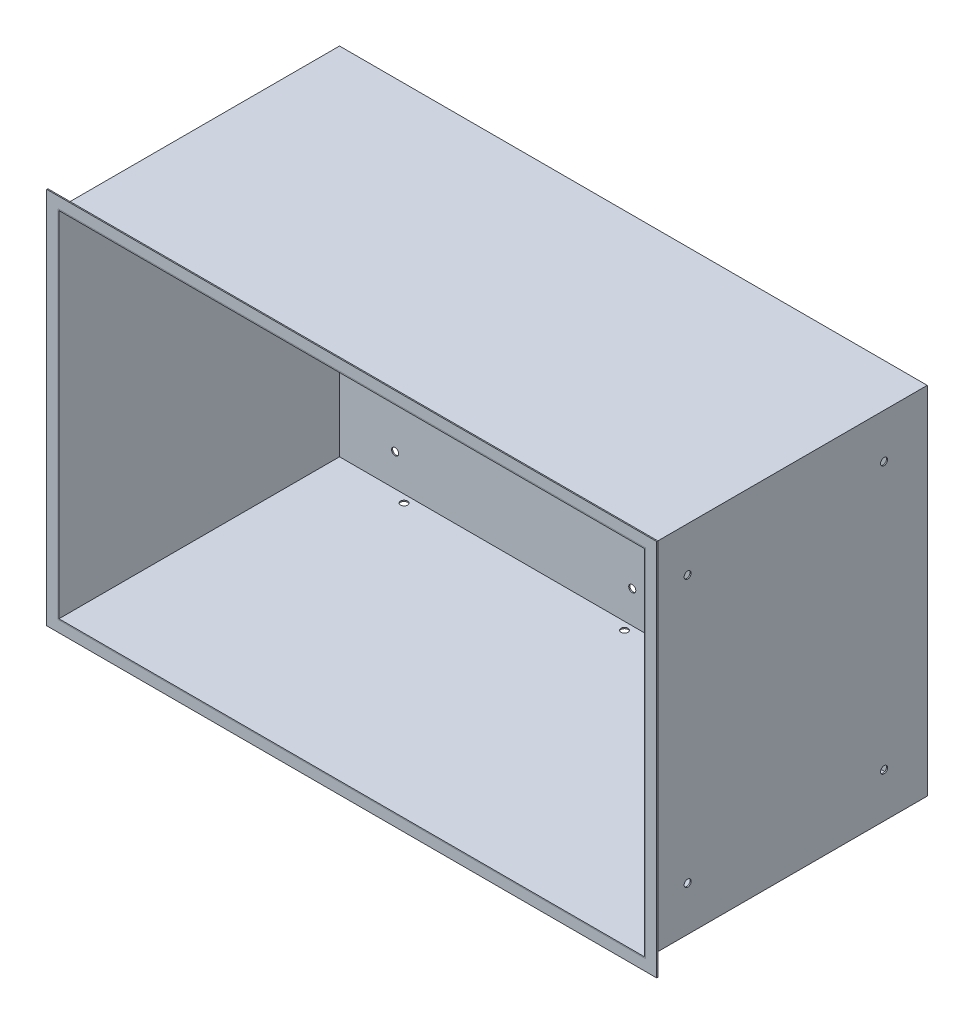
ISO-10303-21;
HEADER;
FILE_DESCRIPTION(('STEP AP214'),'2;1');
FILE_NAME('part.step','',(''),(''),'','','');
FILE_SCHEMA(('AUTOMOTIVE_DESIGN { 1 0 10303 214 1 1 1 1 }'));
ENDSEC;
DATA;
#1=APPLICATION_CONTEXT('core data for automotive mechanical design processes');
#2=APPLICATION_PROTOCOL_DEFINITION('international standard','automotive_design',2000,#1);
#3=PRODUCT_CONTEXT('',#1,'mechanical');
#4=PRODUCT('Part','Part','',(#3));
#5=PRODUCT_RELATED_PRODUCT_CATEGORY('part','',(#4));
#6=PRODUCT_DEFINITION_FORMATION('','',#4);
#7=PRODUCT_DEFINITION_CONTEXT('part definition',#1,'design');
#8=PRODUCT_DEFINITION('design','',#6,#7);
#9=PRODUCT_DEFINITION_SHAPE('','',#8);
#10=(LENGTH_UNIT() NAMED_UNIT(*) SI_UNIT(.MILLI.,.METRE.));
#11=(NAMED_UNIT(*) PLANE_ANGLE_UNIT() SI_UNIT($,.RADIAN.));
#12=(NAMED_UNIT(*) SI_UNIT($,.STERADIAN.) SOLID_ANGLE_UNIT());
#13=UNCERTAINTY_MEASURE_WITH_UNIT(LENGTH_MEASURE(1.E-05),#10,'distance_accuracy_value','');
#14=(GEOMETRIC_REPRESENTATION_CONTEXT(3) GLOBAL_UNCERTAINTY_ASSIGNED_CONTEXT((#13)) GLOBAL_UNIT_ASSIGNED_CONTEXT((#10,
#11,#12)) REPRESENTATION_CONTEXT('',''));
#15=CARTESIAN_POINT('',(0.,0.,0.));
#16=DIRECTION('',(0.,0.,1.));
#17=DIRECTION('',(1.,0.,0.));
#18=AXIS2_PLACEMENT_3D('',#15,#16,#17);
#19=CARTESIAN_POINT('',(411.5,495.,188.48));
#20=DIRECTION('',(0.,1.,0.));
#21=DIRECTION('',(-1.,0.,0.));
#22=AXIS2_PLACEMENT_3D('',#19,#20,#21);
#23=PLANE('',#22);
#24=DIRECTION('',(-1.,0.,0.));
#25=VECTOR('',#24,1.);
#26=CARTESIAN_POINT('',(411.5,495.,190.));
#27=LINE('',#26,#25);
#28=CARTESIAN_POINT('',(411.5,495.,190.));
#29=VERTEX_POINT('',#28);
#30=CARTESIAN_POINT('',(-411.5,495.,190.));
#31=VERTEX_POINT('',#30);
#32=EDGE_CURVE('E140',#29,#31,#27,.T.);
#33=ORIENTED_EDGE('',*,*,#32,.F.);
#34=DIRECTION('',(0.,0.,1.));
#35=VECTOR('',#34,1.);
#36=CARTESIAN_POINT('',(411.5,495.,188.48));
#37=LINE('',#36,#35);
#38=CARTESIAN_POINT('',(411.5,495.,188.48));
#39=VERTEX_POINT('',#38);
#40=EDGE_CURVE('E12',#39,#29,#37,.T.);
#41=ORIENTED_EDGE('',*,*,#40,.F.);
#42=DIRECTION('',(-1.,0.,0.));
#43=VECTOR('',#42,1.);
#44=CARTESIAN_POINT('',(411.5,495.,188.48));
#45=LINE('',#44,#43);
#46=CARTESIAN_POINT('',(-411.5,495.,188.48));
#47=VERTEX_POINT('',#46);
#48=EDGE_CURVE('E144',#39,#47,#45,.T.);
#49=ORIENTED_EDGE('',*,*,#48,.T.);
#50=DIRECTION('',(0.,0.,1.));
#51=VECTOR('',#50,1.);
#52=CARTESIAN_POINT('',(-411.5,495.,188.48));
#53=LINE('',#52,#51);
#54=EDGE_CURVE('E45',#47,#31,#53,.T.);
#55=ORIENTED_EDGE('',*,*,#54,.T.);
#56=EDGE_LOOP('',(#33,#41,#49,#55));
#57=FACE_BOUND('',#56,.T.);
#58=ADVANCED_FACE('F42',(#57),#23,.T.);
#59=CARTESIAN_POINT('',(411.5,-15.,188.48));
#60=DIRECTION('',(1.,0.,0.));
#61=DIRECTION('',(0.,0.,-1.));
#62=AXIS2_PLACEMENT_3D('',#59,#60,#61);
#63=PLANE('',#62);
#64=DIRECTION('',(0.,1.,0.));
#65=VECTOR('',#64,1.);
#66=CARTESIAN_POINT('',(411.5,-15.,190.));
#67=LINE('',#66,#65);
#68=CARTESIAN_POINT('',(411.5,-15.,190.));
#69=VERTEX_POINT('',#68);
#70=EDGE_CURVE('E148',#69,#29,#67,.T.);
#71=ORIENTED_EDGE('',*,*,#70,.F.);
#72=DIRECTION('',(0.,0.,1.));
#73=VECTOR('',#72,1.);
#74=CARTESIAN_POINT('',(411.5,-15.,188.48));
#75=LINE('',#74,#73);
#76=CARTESIAN_POINT('',(411.5,-15.,188.48));
#77=VERTEX_POINT('',#76);
#78=EDGE_CURVE('E50',#77,#69,#75,.T.);
#79=ORIENTED_EDGE('',*,*,#78,.F.);
#80=DIRECTION('',(0.,1.,0.));
#81=VECTOR('',#80,1.);
#82=CARTESIAN_POINT('',(411.5,-15.,188.48));
#83=LINE('',#82,#81);
#84=EDGE_CURVE('E154',#77,#39,#83,.T.);
#85=ORIENTED_EDGE('',*,*,#84,.T.);
#86=ORIENTED_EDGE('',*,*,#40,.T.);
#87=EDGE_LOOP('',(#71,#79,#85,#86));
#88=FACE_BOUND('',#87,.T.);
#89=ADVANCED_FACE('F180',(#88),#63,.T.);
#90=CARTESIAN_POINT('',(-411.5,-15.,188.48));
#91=DIRECTION('',(0.,-1.,0.));
#92=DIRECTION('',(0.,0.,-1.));
#93=AXIS2_PLACEMENT_3D('',#90,#91,#92);
#94=PLANE('',#93);
#95=DIRECTION('',(1.,0.,0.));
#96=VECTOR('',#95,1.);
#97=CARTESIAN_POINT('',(-411.5,-15.,190.));
#98=LINE('',#97,#96);
#99=CARTESIAN_POINT('',(-411.5,-15.,190.));
#100=VERTEX_POINT('',#99);
#101=EDGE_CURVE('E162',#100,#69,#98,.T.);
#102=ORIENTED_EDGE('',*,*,#101,.F.);
#103=DIRECTION('',(0.,0.,1.));
#104=VECTOR('',#103,1.);
#105=CARTESIAN_POINT('',(-411.5,-15.,188.48));
#106=LINE('',#105,#104);
#107=CARTESIAN_POINT('',(-411.5,-15.,188.48));
#108=VERTEX_POINT('',#107);
#109=EDGE_CURVE('E167',#108,#100,#106,.T.);
#110=ORIENTED_EDGE('',*,*,#109,.F.);
#111=DIRECTION('',(1.,0.,0.));
#112=VECTOR('',#111,1.);
#113=CARTESIAN_POINT('',(-411.5,-15.,188.48));
#114=LINE('',#113,#112);
#115=EDGE_CURVE('E151',#108,#77,#114,.T.);
#116=ORIENTED_EDGE('',*,*,#115,.T.);
#117=ORIENTED_EDGE('',*,*,#78,.T.);
#118=EDGE_LOOP('',(#102,#110,#116,#117));
#119=FACE_BOUND('',#118,.T.);
#120=ADVANCED_FACE('F184',(#119),#94,.T.);
#121=CARTESIAN_POINT('',(-411.5,495.,188.48));
#122=DIRECTION('',(-1.,0.,0.));
#123=DIRECTION('',(0.,-1.,0.));
#124=AXIS2_PLACEMENT_3D('',#121,#122,#123);
#125=PLANE('',#124);
#126=DIRECTION('',(0.,-1.,0.));
#127=VECTOR('',#126,1.);
#128=CARTESIAN_POINT('',(-411.5,495.,190.));
#129=LINE('',#128,#127);
#130=EDGE_CURVE('E159',#31,#100,#129,.T.);
#131=ORIENTED_EDGE('',*,*,#130,.F.);
#132=ORIENTED_EDGE('',*,*,#54,.F.);
#133=DIRECTION('',(0.,-1.,0.));
#134=VECTOR('',#133,1.);
#135=CARTESIAN_POINT('',(-411.5,495.,188.48));
#136=LINE('',#135,#134);
#137=EDGE_CURVE('E147',#47,#108,#136,.T.);
#138=ORIENTED_EDGE('',*,*,#137,.T.);
#139=ORIENTED_EDGE('',*,*,#109,.T.);
#140=EDGE_LOOP('',(#131,#132,#138,#139));
#141=FACE_BOUND('',#140,.T.);
#142=ADVANCED_FACE('F175',(#141),#125,.T.);
#143=CARTESIAN_POINT('',(0.,0.,188.48));
#144=DIRECTION('',(0.,0.,1.));
#145=DIRECTION('',(1.,0.,0.));
#146=AXIS2_PLACEMENT_3D('',#143,#144,#145);
#147=PLANE('',#146);
#148=DIRECTION('',(0.,1.,0.));
#149=VECTOR('',#148,1.);
#150=CARTESIAN_POINT('',(396.5,0.,188.48));
#151=LINE('',#150,#149);
#152=CARTESIAN_POINT('',(396.5,0.,188.48));
#153=VERTEX_POINT('',#152);
#154=CARTESIAN_POINT('',(396.5,480.,188.48));
#155=VERTEX_POINT('',#154);
#156=EDGE_CURVE('E115',#153,#155,#151,.T.);
#157=ORIENTED_EDGE('',*,*,#156,.T.);
#158=DIRECTION('',(-1.,0.,0.));
#159=VECTOR('',#158,1.);
#160=CARTESIAN_POINT('',(396.5,480.,188.48));
#161=LINE('',#160,#159);
#162=CARTESIAN_POINT('',(-396.5,480.,188.48));
#163=VERTEX_POINT('',#162);
#164=EDGE_CURVE('E109',#155,#163,#161,.T.);
#165=ORIENTED_EDGE('',*,*,#164,.T.);
#166=DIRECTION('',(0.,-1.,0.));
#167=VECTOR('',#166,1.);
#168=CARTESIAN_POINT('',(-396.5,480.,188.48));
#169=LINE('',#168,#167);
#170=CARTESIAN_POINT('',(-396.5,0.,188.48));
#171=VERTEX_POINT('',#170);
#172=EDGE_CURVE('E118',#163,#171,#169,.T.);
#173=ORIENTED_EDGE('',*,*,#172,.T.);
#174=DIRECTION('',(1.,0.,0.));
#175=VECTOR('',#174,1.);
#176=CARTESIAN_POINT('',(-396.5,0.,188.48));
#177=LINE('',#176,#175);
#178=EDGE_CURVE('E58',#171,#153,#177,.T.);
#179=ORIENTED_EDGE('',*,*,#178,.T.);
#180=EDGE_LOOP('',(#157,#165,#173,#179));
#181=FACE_BOUND('',#180,.T.);
#182=ORIENTED_EDGE('',*,*,#48,.F.);
#183=ORIENTED_EDGE('',*,*,#84,.F.);
#184=ORIENTED_EDGE('',*,*,#115,.F.);
#185=ORIENTED_EDGE('',*,*,#137,.F.);
#186=EDGE_LOOP('',(#182,#183,#184,#185));
#187=FACE_BOUND('',#186,.T.);
#188=ADVANCED_FACE('F122',(#181,#187),#147,.F.);
#189=CARTESIAN_POINT('',(0.,0.,190.));
#190=DIRECTION('',(0.,0.,1.));
#191=DIRECTION('',(1.,0.,0.));
#192=AXIS2_PLACEMENT_3D('',#189,#190,#191);
#193=PLANE('',#192);
#194=DIRECTION('',(-1.,0.,0.));
#195=VECTOR('',#194,1.);
#196=CARTESIAN_POINT('',(396.5,480.,190.));
#197=LINE('',#196,#195);
#198=CARTESIAN_POINT('',(396.5,480.,190.));
#199=VERTEX_POINT('',#198);
#200=CARTESIAN_POINT('',(-396.5,480.,190.));
#201=VERTEX_POINT('',#200);
#202=EDGE_CURVE('E66',#199,#201,#197,.T.);
#203=ORIENTED_EDGE('',*,*,#202,.F.);
#204=DIRECTION('',(0.,1.,0.));
#205=VECTOR('',#204,1.);
#206=CARTESIAN_POINT('',(396.5,0.,190.));
#207=LINE('',#206,#205);
#208=CARTESIAN_POINT('',(396.5,0.,190.));
#209=VERTEX_POINT('',#208);
#210=EDGE_CURVE('E125',#209,#199,#207,.T.);
#211=ORIENTED_EDGE('',*,*,#210,.F.);
#212=DIRECTION('',(1.,0.,0.));
#213=VECTOR('',#212,1.);
#214=CARTESIAN_POINT('',(-396.5,0.,190.));
#215=LINE('',#214,#213);
#216=CARTESIAN_POINT('',(-396.5,0.,190.));
#217=VERTEX_POINT('',#216);
#218=EDGE_CURVE('E128',#217,#209,#215,.T.);
#219=ORIENTED_EDGE('',*,*,#218,.F.);
#220=DIRECTION('',(0.,-1.,0.));
#221=VECTOR('',#220,1.);
#222=CARTESIAN_POINT('',(-396.5,480.,190.));
#223=LINE('',#222,#221);
#224=EDGE_CURVE('E134',#201,#217,#223,.T.);
#225=ORIENTED_EDGE('',*,*,#224,.F.);
#226=EDGE_LOOP('',(#203,#211,#219,#225));
#227=FACE_BOUND('',#226,.T.);
#228=ORIENTED_EDGE('',*,*,#32,.T.);
#229=ORIENTED_EDGE('',*,*,#130,.T.);
#230=ORIENTED_EDGE('',*,*,#101,.T.);
#231=ORIENTED_EDGE('',*,*,#70,.T.);
#232=EDGE_LOOP('',(#228,#229,#230,#231));
#233=FACE_BOUND('',#232,.T.);
#234=ADVANCED_FACE('F177',(#227,#233),#193,.T.);
#235=CARTESIAN_POINT('',(396.5,480.,188.48));
#236=DIRECTION('',(0.,1.,0.));
#237=DIRECTION('',(0.,0.,1.));
#238=AXIS2_PLACEMENT_3D('',#235,#236,#237);
#239=PLANE('',#238);
#240=ORIENTED_EDGE('',*,*,#202,.T.);
#241=DIRECTION('',(0.,0.,1.));
#242=VECTOR('',#241,1.);
#243=CARTESIAN_POINT('',(-396.5,480.,188.48));
#244=LINE('',#243,#242);
#245=EDGE_CURVE('E105',#163,#201,#244,.T.);
#246=ORIENTED_EDGE('',*,*,#245,.F.);
#247=ORIENTED_EDGE('',*,*,#164,.F.);
#248=DIRECTION('',(0.,0.,1.));
#249=VECTOR('',#248,1.);
#250=CARTESIAN_POINT('',(396.5,480.,188.48));
#251=LINE('',#250,#249);
#252=EDGE_CURVE('E138',#155,#199,#251,.T.);
#253=ORIENTED_EDGE('',*,*,#252,.T.);
#254=EDGE_LOOP('',(#240,#246,#247,#253));
#255=FACE_BOUND('',#254,.T.);
#256=ADVANCED_FACE('F107',(#255),#239,.F.);
#257=CARTESIAN_POINT('',(396.5,0.,188.48));
#258=DIRECTION('',(1.,0.,0.));
#259=DIRECTION('',(0.,0.,-1.));
#260=AXIS2_PLACEMENT_3D('',#257,#258,#259);
#261=PLANE('',#260);
#262=ORIENTED_EDGE('',*,*,#210,.T.);
#263=ORIENTED_EDGE('',*,*,#252,.F.);
#264=ORIENTED_EDGE('',*,*,#156,.F.);
#265=DIRECTION('',(0.,0.,1.));
#266=VECTOR('',#265,1.);
#267=CARTESIAN_POINT('',(396.5,0.,188.48));
#268=LINE('',#267,#266);
#269=EDGE_CURVE('E141',#153,#209,#268,.T.);
#270=ORIENTED_EDGE('',*,*,#269,.T.);
#271=EDGE_LOOP('',(#262,#263,#264,#270));
#272=FACE_BOUND('',#271,.T.);
#273=ADVANCED_FACE('F235',(#272),#261,.F.);
#274=CARTESIAN_POINT('',(-396.5,0.,188.48));
#275=DIRECTION('',(0.,-1.,0.));
#276=DIRECTION('',(0.,0.,-1.));
#277=AXIS2_PLACEMENT_3D('',#274,#275,#276);
#278=PLANE('',#277);
#279=ORIENTED_EDGE('',*,*,#218,.T.);
#280=ORIENTED_EDGE('',*,*,#269,.F.);
#281=ORIENTED_EDGE('',*,*,#178,.F.);
#282=DIRECTION('',(0.,0.,1.));
#283=VECTOR('',#282,1.);
#284=CARTESIAN_POINT('',(-396.5,0.,188.48));
#285=LINE('',#284,#283);
#286=EDGE_CURVE('E114',#171,#217,#285,.T.);
#287=ORIENTED_EDGE('',*,*,#286,.T.);
#288=EDGE_LOOP('',(#279,#280,#281,#287));
#289=FACE_BOUND('',#288,.T.);
#290=ADVANCED_FACE('F244',(#289),#278,.F.);
#291=CARTESIAN_POINT('',(-396.5,480.,188.48));
#292=DIRECTION('',(-1.,0.,0.));
#293=DIRECTION('',(0.,0.,1.));
#294=AXIS2_PLACEMENT_3D('',#291,#292,#293);
#295=PLANE('',#294);
#296=ORIENTED_EDGE('',*,*,#224,.T.);
#297=ORIENTED_EDGE('',*,*,#286,.F.);
#298=ORIENTED_EDGE('',*,*,#172,.F.);
#299=ORIENTED_EDGE('',*,*,#245,.T.);
#300=EDGE_LOOP('',(#296,#297,#298,#299));
#301=FACE_BOUND('',#300,.T.);
#302=ADVANCED_FACE('F119',(#301),#295,.F.);
#303=CLOSED_SHELL('',(#58,#89,#120,#142,#188,#234,#256,#273,#290,#302));
#304=MANIFOLD_SOLID_BREP('B2',#303);
#305=CARTESIAN_POINT('',(-396.5,480.,190.));
#306=DIRECTION('',(0.,0.,-1.));
#307=DIRECTION('',(-1.,0.,0.));
#308=AXIS2_PLACEMENT_3D('',#305,#306,#307);
#309=PLANE('',#308);
#310=DIRECTION('',(1.,0.,0.));
#311=VECTOR('',#310,1.);
#312=CARTESIAN_POINT('',(-396.5,0.,190.));
#313=LINE('',#312,#311);
#314=CARTESIAN_POINT('',(-396.5,0.,190.));
#315=VERTEX_POINT('',#314);
#316=CARTESIAN_POINT('',(396.5,0.,190.));
#317=VERTEX_POINT('',#316);
#318=EDGE_CURVE('E318',#315,#317,#313,.T.);
#319=ORIENTED_EDGE('',*,*,#318,.T.);
#320=DIRECTION('',(0.,-1.,0.));
#321=VECTOR('',#320,1.);
#322=CARTESIAN_POINT('',(396.5,480.,190.));
#323=LINE('',#322,#321);
#324=CARTESIAN_POINT('',(396.5,480.,190.));
#325=VERTEX_POINT('',#324);
#326=EDGE_CURVE('E390',#325,#317,#323,.T.);
#327=ORIENTED_EDGE('',*,*,#326,.F.);
#328=DIRECTION('',(1.,0.,0.));
#329=VECTOR('',#328,1.);
#330=CARTESIAN_POINT('',(-396.5,480.,190.));
#331=LINE('',#330,#329);
#332=CARTESIAN_POINT('',(-396.5,480.,190.));
#333=VERTEX_POINT('',#332);
#334=EDGE_CURVE('E297',#333,#325,#331,.T.);
#335=ORIENTED_EDGE('',*,*,#334,.F.);
#336=DIRECTION('',(0.,-1.,0.));
#337=VECTOR('',#336,1.);
#338=CARTESIAN_POINT('',(-396.5,480.,190.));
#339=LINE('',#338,#337);
#340=EDGE_CURVE('E400',#333,#315,#339,.T.);
#341=ORIENTED_EDGE('',*,*,#340,.T.);
#342=EDGE_LOOP('',(#319,#327,#335,#341));
#343=FACE_BOUND('',#342,.T.);
#344=DIRECTION('',(1.,0.,0.));
#345=VECTOR('',#344,1.);
#346=CARTESIAN_POINT('',(-396.5,1.52000000000002,190.));
#347=LINE('',#346,#345);
#348=CARTESIAN_POINT('',(-394.98,1.52,190.));
#349=VERTEX_POINT('',#348);
#350=CARTESIAN_POINT('',(394.98,1.52,190.));
#351=VERTEX_POINT('',#350);
#352=EDGE_CURVE('E371',#349,#351,#347,.T.);
#353=ORIENTED_EDGE('',*,*,#352,.F.);
#354=DIRECTION('',(0.,-1.,0.));
#355=VECTOR('',#354,1.);
#356=CARTESIAN_POINT('',(-394.98,480.,190.));
#357=LINE('',#356,#355);
#358=CARTESIAN_POINT('',(-394.98,478.48,190.));
#359=VERTEX_POINT('',#358);
#360=EDGE_CURVE('E366',#359,#349,#357,.T.);
#361=ORIENTED_EDGE('',*,*,#360,.F.);
#362=DIRECTION('',(1.,0.,0.));
#363=VECTOR('',#362,1.);
#364=CARTESIAN_POINT('',(-396.5,478.48,190.));
#365=LINE('',#364,#363);
#366=CARTESIAN_POINT('',(394.98,478.48,190.));
#367=VERTEX_POINT('',#366);
#368=EDGE_CURVE('E288',#359,#367,#365,.T.);
#369=ORIENTED_EDGE('',*,*,#368,.T.);
#370=DIRECTION('',(0.,-1.,0.));
#371=VECTOR('',#370,1.);
#372=CARTESIAN_POINT('',(394.98,480.,190.));
#373=LINE('',#372,#371);
#374=EDGE_CURVE('E379',#367,#351,#373,.T.);
#375=ORIENTED_EDGE('',*,*,#374,.T.);
#376=EDGE_LOOP('',(#353,#361,#369,#375));
#377=FACE_BOUND('',#376,.T.);
#378=ADVANCED_FACE('F271',(#343,#377),#309,.F.);
#379=CARTESIAN_POINT('',(396.5,480.,-190.));
#380=DIRECTION('',(-1.,0.,0.));
#381=DIRECTION('',(0.,0.,1.));
#382=AXIS2_PLACEMENT_3D('',#379,#380,#381);
#383=PLANE('',#382);
#384=CARTESIAN_POINT('',(396.5,60.0000000000001,133.26));
#385=DIRECTION('',(1.,0.,0.));
#386=DIRECTION('',(0.,0.,-1.));
#387=AXIS2_PLACEMENT_3D('',#384,#385,#386);
#388=CIRCLE('',#387,4.76250000000001);
#389=CARTESIAN_POINT('',(396.5,60.0000000000001,128.4975));
#390=VERTEX_POINT('',#389);
#391=EDGE_CURVE('E412',#390,#390,#388,.T.);
#392=ORIENTED_EDGE('',*,*,#391,.F.);
#393=EDGE_LOOP('',(#392));
#394=FACE_BOUND('',#393,.T.);
#395=CARTESIAN_POINT('',(396.5,420.,-131.74));
#396=DIRECTION('',(1.,0.,0.));
#397=DIRECTION('',(0.,0.,1.));
#398=AXIS2_PLACEMENT_3D('',#395,#396,#397);
#399=CIRCLE('',#398,4.76499999999997);
#400=CARTESIAN_POINT('',(396.5,420.,-126.975));
#401=VERTEX_POINT('',#400);
#402=EDGE_CURVE('E506',#401,#401,#399,.T.);
#403=ORIENTED_EDGE('',*,*,#402,.F.);
#404=EDGE_LOOP('',(#403));
#405=FACE_BOUND('',#404,.T.);
#406=CARTESIAN_POINT('',(396.5,420.,133.26));
#407=DIRECTION('',(1.,0.,0.));
#408=DIRECTION('',(0.,0.,1.));
#409=AXIS2_PLACEMENT_3D('',#406,#407,#408);
#410=CIRCLE('',#409,4.76250000000001);
#411=CARTESIAN_POINT('',(396.5,420.,138.0225));
#412=VERTEX_POINT('',#411);
#413=EDGE_CURVE('E503',#412,#412,#410,.T.);
#414=ORIENTED_EDGE('',*,*,#413,.F.);
#415=EDGE_LOOP('',(#414));
#416=FACE_BOUND('',#415,.T.);
#417=CARTESIAN_POINT('',(396.5,60.0000000000001,-131.74));
#418=DIRECTION('',(1.,0.,0.));
#419=DIRECTION('',(0.,0.,-1.));
#420=AXIS2_PLACEMENT_3D('',#417,#418,#419);
#421=CIRCLE('',#420,4.76499999999998);
#422=CARTESIAN_POINT('',(396.5,60.0000000000001,-136.505));
#423=VERTEX_POINT('',#422);
#424=EDGE_CURVE('E407',#423,#423,#421,.T.);
#425=ORIENTED_EDGE('',*,*,#424,.F.);
#426=EDGE_LOOP('',(#425));
#427=FACE_BOUND('',#426,.T.);
#428=DIRECTION('',(0.,0.,-1.));
#429=VECTOR('',#428,1.);
#430=CARTESIAN_POINT('',(396.5,0.,-190.));
#431=LINE('',#430,#429);
#432=CARTESIAN_POINT('',(396.5,0.,-190.));
#433=VERTEX_POINT('',#432);
#434=EDGE_CURVE('E391',#317,#433,#431,.T.);
#435=ORIENTED_EDGE('',*,*,#434,.T.);
#436=DIRECTION('',(0.,-1.,0.));
#437=VECTOR('',#436,1.);
#438=CARTESIAN_POINT('',(396.5,480.,-190.));
#439=LINE('',#438,#437);
#440=CARTESIAN_POINT('',(396.5,480.,-190.));
#441=VERTEX_POINT('',#440);
#442=EDGE_CURVE('E40',#441,#433,#439,.T.);
#443=ORIENTED_EDGE('',*,*,#442,.F.);
#444=DIRECTION('',(0.,0.,-1.));
#445=VECTOR('',#444,1.);
#446=CARTESIAN_POINT('',(396.5,480.,-190.));
#447=LINE('',#446,#445);
#448=EDGE_CURVE('E384',#325,#441,#447,.T.);
#449=ORIENTED_EDGE('',*,*,#448,.F.);
#450=ORIENTED_EDGE('',*,*,#326,.T.);
#451=EDGE_LOOP('',(#435,#443,#449,#450));
#452=FACE_BOUND('',#451,.T.);
#453=ADVANCED_FACE('F273',(#394,#405,#416,#427,#452),#383,.F.);
#454=CARTESIAN_POINT('',(-396.5,480.,-190.));
#455=DIRECTION('',(0.,0.,1.));
#456=DIRECTION('',(1.,0.,0.));
#457=AXIS2_PLACEMENT_3D('',#454,#455,#456);
#458=PLANE('',#457);
#459=CARTESIAN_POINT('',(0.,435.,-190.));
#460=DIRECTION('',(0.,0.,1.));
#461=DIRECTION('',(1.,0.,0.));
#462=AXIS2_PLACEMENT_3D('',#459,#460,#461);
#463=CIRCLE('',#462,4.76500000000001);
#464=CARTESIAN_POINT('',(4.7650000000001,435.,-190.));
#465=VERTEX_POINT('',#464);
#466=EDGE_CURVE('E494',#465,#465,#463,.T.);
#467=ORIENTED_EDGE('',*,*,#466,.T.);
#468=EDGE_LOOP('',(#467));
#469=FACE_BOUND('',#468,.T.);
#470=CARTESIAN_POINT('',(0.,45.,-190.));
#471=DIRECTION('',(0.,0.,1.));
#472=DIRECTION('',(1.,0.,0.));
#473=AXIS2_PLACEMENT_3D('',#470,#471,#472);
#474=CIRCLE('',#473,4.765);
#475=CARTESIAN_POINT('',(4.76500000000008,45.,-190.));
#476=VERTEX_POINT('',#475);
#477=EDGE_CURVE('E491',#476,#476,#474,.T.);
#478=ORIENTED_EDGE('',*,*,#477,.T.);
#479=EDGE_LOOP('',(#478));
#480=FACE_BOUND('',#479,.T.);
#481=CARTESIAN_POINT('',(320.,240.,-190.));
#482=DIRECTION('',(0.,0.,1.));
#483=DIRECTION('',(1.,0.,0.));
#484=AXIS2_PLACEMENT_3D('',#481,#482,#483);
#485=CIRCLE('',#484,4.76250000000001);
#486=CARTESIAN_POINT('',(324.7625,240.,-190.));
#487=VERTEX_POINT('',#486);
#488=EDGE_CURVE('E488',#487,#487,#485,.T.);
#489=ORIENTED_EDGE('',*,*,#488,.T.);
#490=EDGE_LOOP('',(#489));
#491=FACE_BOUND('',#490,.T.);
#492=CARTESIAN_POINT('',(320.,435.,-190.));
#493=DIRECTION('',(0.,0.,1.));
#494=DIRECTION('',(1.,0.,0.));
#495=AXIS2_PLACEMENT_3D('',#492,#493,#494);
#496=CIRCLE('',#495,4.76500000000001);
#497=CARTESIAN_POINT('',(324.765,435.,-190.));
#498=VERTEX_POINT('',#497);
#499=EDGE_CURVE('E485',#498,#498,#496,.T.);
#500=ORIENTED_EDGE('',*,*,#499,.T.);
#501=EDGE_LOOP('',(#500));
#502=FACE_BOUND('',#501,.T.);
#503=CARTESIAN_POINT('',(320.,45.,-190.));
#504=DIRECTION('',(0.,0.,1.));
#505=DIRECTION('',(1.,0.,0.));
#506=AXIS2_PLACEMENT_3D('',#503,#504,#505);
#507=CIRCLE('',#506,4.76500000000001);
#508=CARTESIAN_POINT('',(324.765,45.,-190.));
#509=VERTEX_POINT('',#508);
#510=EDGE_CURVE('E482',#509,#509,#507,.T.);
#511=ORIENTED_EDGE('',*,*,#510,.T.);
#512=EDGE_LOOP('',(#511));
#513=FACE_BOUND('',#512,.T.);
#514=CARTESIAN_POINT('',(-320.,45.,-190.));
#515=DIRECTION('',(0.,0.,1.));
#516=DIRECTION('',(1.,0.,0.));
#517=AXIS2_PLACEMENT_3D('',#514,#515,#516);
#518=CIRCLE('',#517,4.76500000000001);
#519=CARTESIAN_POINT('',(-315.235,45.,-190.));
#520=VERTEX_POINT('',#519);
#521=EDGE_CURVE('E479',#520,#520,#518,.T.);
#522=ORIENTED_EDGE('',*,*,#521,.T.);
#523=EDGE_LOOP('',(#522));
#524=FACE_BOUND('',#523,.T.);
#525=CARTESIAN_POINT('',(-320.,240.,-190.));
#526=DIRECTION('',(0.,0.,1.));
#527=DIRECTION('',(1.,0.,0.));
#528=AXIS2_PLACEMENT_3D('',#525,#526,#527);
#529=CIRCLE('',#528,4.76250000000001);
#530=CARTESIAN_POINT('',(-315.2375,240.,-190.));
#531=VERTEX_POINT('',#530);
#532=EDGE_CURVE('E471',#531,#531,#529,.T.);
#533=ORIENTED_EDGE('',*,*,#532,.T.);
#534=EDGE_LOOP('',(#533));
#535=FACE_BOUND('',#534,.T.);
#536=CARTESIAN_POINT('',(-320.,435.,-190.));
#537=DIRECTION('',(0.,0.,1.));
#538=DIRECTION('',(1.,0.,0.));
#539=AXIS2_PLACEMENT_3D('',#536,#537,#538);
#540=CIRCLE('',#539,4.76500000000001);
#541=CARTESIAN_POINT('',(-315.235,435.,-190.));
#542=VERTEX_POINT('',#541);
#543=EDGE_CURVE('E500',#542,#542,#540,.T.);
#544=ORIENTED_EDGE('',*,*,#543,.T.);
#545=EDGE_LOOP('',(#544));
#546=FACE_BOUND('',#545,.T.);
#547=DIRECTION('',(-1.,0.,0.));
#548=VECTOR('',#547,1.);
#549=CARTESIAN_POINT('',(-396.5,0.,-190.));
#550=LINE('',#549,#548);
#551=CARTESIAN_POINT('',(-396.5,0.,-190.));
#552=VERTEX_POINT('',#551);
#553=EDGE_CURVE('E394',#433,#552,#550,.T.);
#554=ORIENTED_EDGE('',*,*,#553,.T.);
#555=DIRECTION('',(0.,-1.,0.));
#556=VECTOR('',#555,1.);
#557=CARTESIAN_POINT('',(-396.5,480.,-190.));
#558=LINE('',#557,#556);
#559=CARTESIAN_POINT('',(-396.5,480.,-190.));
#560=VERTEX_POINT('',#559);
#561=EDGE_CURVE('E280',#560,#552,#558,.T.);
#562=ORIENTED_EDGE('',*,*,#561,.F.);
#563=DIRECTION('',(-1.,0.,0.));
#564=VECTOR('',#563,1.);
#565=CARTESIAN_POINT('',(-396.5,480.,-190.));
#566=LINE('',#565,#564);
#567=EDGE_CURVE('E325',#441,#560,#566,.T.);
#568=ORIENTED_EDGE('',*,*,#567,.F.);
#569=ORIENTED_EDGE('',*,*,#442,.T.);
#570=EDGE_LOOP('',(#554,#562,#568,#569));
#571=FACE_BOUND('',#570,.T.);
#572=ADVANCED_FACE('F525',(#469,#480,#491,#502,#513,#524,#535,#546,#571),#458,.F.);
#573=CARTESIAN_POINT('',(-396.5,480.,-190.));
#574=DIRECTION('',(1.,0.,0.));
#575=DIRECTION('',(0.,0.,-1.));
#576=AXIS2_PLACEMENT_3D('',#573,#574,#575);
#577=PLANE('',#576);
#578=DIRECTION('',(0.,0.,1.));
#579=VECTOR('',#578,1.);
#580=CARTESIAN_POINT('',(-396.5,0.,-190.));
#581=LINE('',#580,#579);
#582=EDGE_CURVE('E396',#552,#315,#581,.T.);
#583=ORIENTED_EDGE('',*,*,#582,.T.);
#584=ORIENTED_EDGE('',*,*,#340,.F.);
#585=DIRECTION('',(0.,0.,1.));
#586=VECTOR('',#585,1.);
#587=CARTESIAN_POINT('',(-396.5,480.,-190.));
#588=LINE('',#587,#586);
#589=EDGE_CURVE('E387',#560,#333,#588,.T.);
#590=ORIENTED_EDGE('',*,*,#589,.F.);
#591=ORIENTED_EDGE('',*,*,#561,.T.);
#592=EDGE_LOOP('',(#583,#584,#590,#591));
#593=FACE_BOUND('',#592,.T.);
#594=ADVANCED_FACE('F531',(#593),#577,.F.);
#595=CARTESIAN_POINT('',(0.,480.,0.));
#596=DIRECTION('',(0.,1.,0.));
#597=DIRECTION('',(0.,0.,1.));
#598=AXIS2_PLACEMENT_3D('',#595,#596,#597);
#599=PLANE('',#598);
#600=ORIENTED_EDGE('',*,*,#448,.T.);
#601=ORIENTED_EDGE('',*,*,#567,.T.);
#602=ORIENTED_EDGE('',*,*,#589,.T.);
#603=ORIENTED_EDGE('',*,*,#334,.T.);
#604=EDGE_LOOP('',(#600,#601,#602,#603));
#605=FACE_BOUND('',#604,.T.);
#606=ADVANCED_FACE('F533',(#605),#599,.T.);
#607=CARTESIAN_POINT('',(0.,0.,0.));
#608=DIRECTION('',(0.,1.,0.));
#609=DIRECTION('',(0.,0.,1.));
#610=AXIS2_PLACEMENT_3D('',#607,#608,#609);
#611=PLANE('',#610);
#612=CARTESIAN_POINT('',(372.5,0.,-37.3999999999999));
#613=DIRECTION('',(0.,-1.,0.));
#614=DIRECTION('',(0.,0.,-1.));
#615=AXIS2_PLACEMENT_3D('',#612,#613,#614);
#616=CIRCLE('',#615,12.7);
#617=CARTESIAN_POINT('',(372.5,0.,-50.0999999999999));
#618=VERTEX_POINT('',#617);
#619=EDGE_CURVE('E436',#618,#618,#616,.T.);
#620=ORIENTED_EDGE('',*,*,#619,.F.);
#621=EDGE_LOOP('',(#620));
#622=FACE_BOUND('',#621,.T.);
#623=CARTESIAN_POINT('',(372.5,0.,13.0000000000001));
#624=DIRECTION('',(0.,-1.,0.));
#625=DIRECTION('',(0.,0.,-1.));
#626=AXIS2_PLACEMENT_3D('',#623,#624,#625);
#627=CIRCLE('',#626,12.7);
#628=CARTESIAN_POINT('',(372.5,0.,0.300000000000069));
#629=VERTEX_POINT('',#628);
#630=EDGE_CURVE('E441',#629,#629,#627,.T.);
#631=ORIENTED_EDGE('',*,*,#630,.F.);
#632=EDGE_LOOP('',(#631));
#633=FACE_BOUND('',#632,.T.);
#634=CARTESIAN_POINT('',(372.5,0.,-87.8));
#635=DIRECTION('',(0.,-1.,0.));
#636=DIRECTION('',(0.,0.,-1.));
#637=AXIS2_PLACEMENT_3D('',#634,#635,#636);
#638=CIRCLE('',#637,12.7);
#639=CARTESIAN_POINT('',(372.5,0.,-100.5));
#640=VERTEX_POINT('',#639);
#641=EDGE_CURVE('E433',#640,#640,#638,.T.);
#642=ORIENTED_EDGE('',*,*,#641,.F.);
#643=EDGE_LOOP('',(#642));
#644=FACE_BOUND('',#643,.T.);
#645=CARTESIAN_POINT('',(0.,0.,-178.));
#646=DIRECTION('',(0.,-1.,0.));
#647=DIRECTION('',(0.,0.,-1.));
#648=AXIS2_PLACEMENT_3D('',#645,#646,#647);
#649=CIRCLE('',#648,4.7625);
#650=CARTESIAN_POINT('',(0.,0.,-182.7625));
#651=VERTEX_POINT('',#650);
#652=EDGE_CURVE('E427',#651,#651,#649,.T.);
#653=ORIENTED_EDGE('',*,*,#652,.F.);
#654=EDGE_LOOP('',(#653));
#655=FACE_BOUND('',#654,.T.);
#656=CARTESIAN_POINT('',(297.375,0.,-178.));
#657=DIRECTION('',(0.,-1.,0.));
#658=DIRECTION('',(0.,0.,-1.));
#659=AXIS2_PLACEMENT_3D('',#656,#657,#658);
#660=CIRCLE('',#659,4.76250000000001);
#661=CARTESIAN_POINT('',(297.375,0.,-182.7625));
#662=VERTEX_POINT('',#661);
#663=EDGE_CURVE('E432',#662,#662,#660,.T.);
#664=ORIENTED_EDGE('',*,*,#663,.F.);
#665=EDGE_LOOP('',(#664));
#666=FACE_BOUND('',#665,.T.);
#667=CARTESIAN_POINT('',(-297.375,0.,-178.));
#668=DIRECTION('',(0.,-1.,0.));
#669=DIRECTION('',(0.,0.,-1.));
#670=AXIS2_PLACEMENT_3D('',#667,#668,#669);
#671=CIRCLE('',#670,4.76250000000001);
#672=CARTESIAN_POINT('',(-297.375,0.,-182.7625));
#673=VERTEX_POINT('',#672);
#674=EDGE_CURVE('E422',#673,#673,#671,.T.);
#675=ORIENTED_EDGE('',*,*,#674,.F.);
#676=EDGE_LOOP('',(#675));
#677=FACE_BOUND('',#676,.T.);
#678=ORIENTED_EDGE('',*,*,#434,.F.);
#679=ORIENTED_EDGE('',*,*,#318,.F.);
#680=ORIENTED_EDGE('',*,*,#582,.F.);
#681=ORIENTED_EDGE('',*,*,#553,.F.);
#682=EDGE_LOOP('',(#678,#679,#680,#681));
#683=FACE_BOUND('',#682,.T.);
#684=ADVANCED_FACE('F529',(#622,#633,#644,#655,#666,#677,#683),#611,.F.);
#685=CARTESIAN_POINT('',(394.98,480.,-190.));
#686=DIRECTION('',(-1.,0.,0.));
#687=DIRECTION('',(0.,0.,1.));
#688=AXIS2_PLACEMENT_3D('',#685,#686,#687);
#689=PLANE('',#688);
#690=CARTESIAN_POINT('',(394.98,60.0000000000001,133.26));
#691=DIRECTION('',(-1.,0.,0.));
#692=DIRECTION('',(0.,0.,1.));
#693=AXIS2_PLACEMENT_3D('',#690,#691,#692);
#694=CIRCLE('',#693,4.76250000000001);
#695=CARTESIAN_POINT('',(394.98,60.0000000000001,138.0225));
#696=VERTEX_POINT('',#695);
#697=EDGE_CURVE('E415',#696,#696,#694,.T.);
#698=ORIENTED_EDGE('',*,*,#697,.F.);
#699=EDGE_LOOP('',(#698));
#700=FACE_BOUND('',#699,.T.);
#701=CARTESIAN_POINT('',(394.98,420.,-131.74));
#702=DIRECTION('',(-1.,0.,0.));
#703=DIRECTION('',(0.,0.,1.));
#704=AXIS2_PLACEMENT_3D('',#701,#702,#703);
#705=CIRCLE('',#704,4.76499999999997);
#706=CARTESIAN_POINT('',(394.98,420.,-126.975));
#707=VERTEX_POINT('',#706);
#708=EDGE_CURVE('E411',#707,#707,#705,.T.);
#709=ORIENTED_EDGE('',*,*,#708,.F.);
#710=EDGE_LOOP('',(#709));
#711=FACE_BOUND('',#710,.T.);
#712=CARTESIAN_POINT('',(394.98,420.,133.26));
#713=DIRECTION('',(-1.,0.,0.));
#714=DIRECTION('',(0.,0.,1.));
#715=AXIS2_PLACEMENT_3D('',#712,#713,#714);
#716=CIRCLE('',#715,4.76250000000001);
#717=CARTESIAN_POINT('',(394.98,420.,138.0225));
#718=VERTEX_POINT('',#717);
#719=EDGE_CURVE('E408',#718,#718,#716,.T.);
#720=ORIENTED_EDGE('',*,*,#719,.F.);
#721=EDGE_LOOP('',(#720));
#722=FACE_BOUND('',#721,.T.);
#723=CARTESIAN_POINT('',(394.98,60.0000000000001,-131.74));
#724=DIRECTION('',(-1.,0.,0.));
#725=DIRECTION('',(0.,0.,1.));
#726=AXIS2_PLACEMENT_3D('',#723,#724,#725);
#727=CIRCLE('',#726,4.76499999999998);
#728=CARTESIAN_POINT('',(394.98,60.0000000000001,-126.975));
#729=VERTEX_POINT('',#728);
#730=EDGE_CURVE('E404',#729,#729,#727,.T.);
#731=ORIENTED_EDGE('',*,*,#730,.F.);
#732=EDGE_LOOP('',(#731));
#733=FACE_BOUND('',#732,.T.);
#734=DIRECTION('',(0.,0.,-1.));
#735=VECTOR('',#734,1.);
#736=CARTESIAN_POINT('',(394.98,1.52000000000002,-190.));
#737=LINE('',#736,#735);
#738=CARTESIAN_POINT('',(394.98,1.52,-188.48));
#739=VERTEX_POINT('',#738);
#740=EDGE_CURVE('E355',#351,#739,#737,.T.);
#741=ORIENTED_EDGE('',*,*,#740,.F.);
#742=ORIENTED_EDGE('',*,*,#374,.F.);
#743=DIRECTION('',(0.,0.,-1.));
#744=VECTOR('',#743,1.);
#745=CARTESIAN_POINT('',(394.98,478.48,-190.));
#746=LINE('',#745,#744);
#747=CARTESIAN_POINT('',(394.98,478.48,-188.48));
#748=VERTEX_POINT('',#747);
#749=EDGE_CURVE('E373',#367,#748,#746,.T.);
#750=ORIENTED_EDGE('',*,*,#749,.T.);
#751=DIRECTION('',(0.,-1.,0.));
#752=VECTOR('',#751,1.);
#753=CARTESIAN_POINT('',(394.98,480.,-188.48));
#754=LINE('',#753,#752);
#755=EDGE_CURVE('E365',#748,#739,#754,.T.);
#756=ORIENTED_EDGE('',*,*,#755,.T.);
#757=EDGE_LOOP('',(#741,#742,#750,#756));
#758=FACE_BOUND('',#757,.T.);
#759=ADVANCED_FACE('F517',(#700,#711,#722,#733,#758),#689,.T.);
#760=CARTESIAN_POINT('',(-396.5,480.,-188.48));
#761=DIRECTION('',(0.,0.,1.));
#762=DIRECTION('',(1.,0.,0.));
#763=AXIS2_PLACEMENT_3D('',#760,#761,#762);
#764=PLANE('',#763);
#765=CARTESIAN_POINT('',(0.,435.,-188.48));
#766=DIRECTION('',(0.,0.,1.));
#767=DIRECTION('',(1.,0.,0.));
#768=AXIS2_PLACEMENT_3D('',#765,#766,#767);
#769=CIRCLE('',#768,4.76500000000001);
#770=CARTESIAN_POINT('',(4.7650000000001,435.,-188.48));
#771=VERTEX_POINT('',#770);
#772=EDGE_CURVE('E421',#771,#771,#769,.T.);
#773=ORIENTED_EDGE('',*,*,#772,.F.);
#774=EDGE_LOOP('',(#773));
#775=FACE_BOUND('',#774,.T.);
#776=CARTESIAN_POINT('',(0.,45.,-188.48));
#777=DIRECTION('',(0.,0.,1.));
#778=DIRECTION('',(1.,0.,0.));
#779=AXIS2_PLACEMENT_3D('',#776,#777,#778);
#780=CIRCLE('',#779,4.765);
#781=CARTESIAN_POINT('',(4.76500000000008,45.,-188.48));
#782=VERTEX_POINT('',#781);
#783=EDGE_CURVE('E463',#782,#782,#780,.T.);
#784=ORIENTED_EDGE('',*,*,#783,.F.);
#785=EDGE_LOOP('',(#784));
#786=FACE_BOUND('',#785,.T.);
#787=CARTESIAN_POINT('',(320.,240.,-188.48));
#788=DIRECTION('',(0.,0.,1.));
#789=DIRECTION('',(1.,0.,0.));
#790=AXIS2_PLACEMENT_3D('',#787,#788,#789);
#791=CIRCLE('',#790,4.76250000000001);
#792=CARTESIAN_POINT('',(324.7625,240.,-188.48));
#793=VERTEX_POINT('',#792);
#794=EDGE_CURVE('E460',#793,#793,#791,.T.);
#795=ORIENTED_EDGE('',*,*,#794,.F.);
#796=EDGE_LOOP('',(#795));
#797=FACE_BOUND('',#796,.T.);
#798=CARTESIAN_POINT('',(320.,435.,-188.48));
#799=DIRECTION('',(0.,0.,1.));
#800=DIRECTION('',(1.,0.,0.));
#801=AXIS2_PLACEMENT_3D('',#798,#799,#800);
#802=CIRCLE('',#801,4.76500000000001);
#803=CARTESIAN_POINT('',(324.765,435.,-188.48));
#804=VERTEX_POINT('',#803);
#805=EDGE_CURVE('E456',#804,#804,#802,.T.);
#806=ORIENTED_EDGE('',*,*,#805,.F.);
#807=EDGE_LOOP('',(#806));
#808=FACE_BOUND('',#807,.T.);
#809=CARTESIAN_POINT('',(320.,45.,-188.48));
#810=DIRECTION('',(0.,0.,1.));
#811=DIRECTION('',(1.,0.,0.));
#812=AXIS2_PLACEMENT_3D('',#809,#810,#811);
#813=CIRCLE('',#812,4.76500000000001);
#814=CARTESIAN_POINT('',(324.765,45.,-188.48));
#815=VERTEX_POINT('',#814);
#816=EDGE_CURVE('E459',#815,#815,#813,.T.);
#817=ORIENTED_EDGE('',*,*,#816,.F.);
#818=EDGE_LOOP('',(#817));
#819=FACE_BOUND('',#818,.T.);
#820=CARTESIAN_POINT('',(-320.,45.,-188.48));
#821=DIRECTION('',(0.,0.,1.));
#822=DIRECTION('',(1.,0.,0.));
#823=AXIS2_PLACEMENT_3D('',#820,#821,#822);
#824=CIRCLE('',#823,4.76500000000001);
#825=CARTESIAN_POINT('',(-315.235,45.,-188.48));
#826=VERTEX_POINT('',#825);
#827=EDGE_CURVE('E472',#826,#826,#824,.T.);
#828=ORIENTED_EDGE('',*,*,#827,.F.);
#829=EDGE_LOOP('',(#828));
#830=FACE_BOUND('',#829,.T.);
#831=CARTESIAN_POINT('',(-320.,240.,-188.48));
#832=DIRECTION('',(0.,0.,1.));
#833=DIRECTION('',(1.,0.,0.));
#834=AXIS2_PLACEMENT_3D('',#831,#832,#833);
#835=CIRCLE('',#834,4.76250000000001);
#836=CARTESIAN_POINT('',(-315.2375,240.,-188.48));
#837=VERTEX_POINT('',#836);
#838=EDGE_CURVE('E468',#837,#837,#835,.T.);
#839=ORIENTED_EDGE('',*,*,#838,.F.);
#840=EDGE_LOOP('',(#839));
#841=FACE_BOUND('',#840,.T.);
#842=CARTESIAN_POINT('',(-320.,435.,-188.48));
#843=DIRECTION('',(0.,0.,1.));
#844=DIRECTION('',(1.,0.,0.));
#845=AXIS2_PLACEMENT_3D('',#842,#843,#844);
#846=CIRCLE('',#845,4.76500000000001);
#847=CARTESIAN_POINT('',(-315.235,435.,-188.48));
#848=VERTEX_POINT('',#847);
#849=EDGE_CURVE('E497',#848,#848,#846,.T.);
#850=ORIENTED_EDGE('',*,*,#849,.F.);
#851=EDGE_LOOP('',(#850));
#852=FACE_BOUND('',#851,.T.);
#853=DIRECTION('',(-1.,0.,0.));
#854=VECTOR('',#853,1.);
#855=CARTESIAN_POINT('',(-396.5,1.52000000000002,-188.48));
#856=LINE('',#855,#854);
#857=CARTESIAN_POINT('',(-394.98,1.52,-188.48));
#858=VERTEX_POINT('',#857);
#859=EDGE_CURVE('E348',#739,#858,#856,.T.);
#860=ORIENTED_EDGE('',*,*,#859,.F.);
#861=ORIENTED_EDGE('',*,*,#755,.F.);
#862=DIRECTION('',(-1.,0.,0.));
#863=VECTOR('',#862,1.);
#864=CARTESIAN_POINT('',(-396.5,478.48,-188.48));
#865=LINE('',#864,#863);
#866=CARTESIAN_POINT('',(-394.98,478.48,-188.48));
#867=VERTEX_POINT('',#866);
#868=EDGE_CURVE('E363',#748,#867,#865,.T.);
#869=ORIENTED_EDGE('',*,*,#868,.T.);
#870=DIRECTION('',(0.,-1.,0.));
#871=VECTOR('',#870,1.);
#872=CARTESIAN_POINT('',(-394.98,480.,-188.48));
#873=LINE('',#872,#871);
#874=EDGE_CURVE('E361',#867,#858,#873,.T.);
#875=ORIENTED_EDGE('',*,*,#874,.T.);
#876=EDGE_LOOP('',(#860,#861,#869,#875));
#877=FACE_BOUND('',#876,.T.);
#878=ADVANCED_FACE('F362',(#775,#786,#797,#808,#819,#830,#841,#852,#877),#764,.T.);
#879=CARTESIAN_POINT('',(-394.98,480.,-190.));
#880=DIRECTION('',(1.,0.,0.));
#881=DIRECTION('',(0.,0.,-1.));
#882=AXIS2_PLACEMENT_3D('',#879,#880,#881);
#883=PLANE('',#882);
#884=DIRECTION('',(0.,0.,1.));
#885=VECTOR('',#884,1.);
#886=CARTESIAN_POINT('',(-394.98,1.52000000000002,-190.));
#887=LINE('',#886,#885);
#888=EDGE_CURVE('E352',#858,#349,#887,.T.);
#889=ORIENTED_EDGE('',*,*,#888,.F.);
#890=ORIENTED_EDGE('',*,*,#874,.F.);
#891=DIRECTION('',(0.,0.,1.));
#892=VECTOR('',#891,1.);
#893=CARTESIAN_POINT('',(-394.98,478.48,-190.));
#894=LINE('',#893,#892);
#895=EDGE_CURVE('E377',#867,#359,#894,.T.);
#896=ORIENTED_EDGE('',*,*,#895,.T.);
#897=ORIENTED_EDGE('',*,*,#360,.T.);
#898=EDGE_LOOP('',(#889,#890,#896,#897));
#899=FACE_BOUND('',#898,.T.);
#900=ADVANCED_FACE('F368',(#899),#883,.T.);
#901=CARTESIAN_POINT('',(0.,478.48,0.));
#902=DIRECTION('',(0.,1.,0.));
#903=DIRECTION('',(0.,0.,1.));
#904=AXIS2_PLACEMENT_3D('',#901,#902,#903);
#905=PLANE('',#904);
#906=ORIENTED_EDGE('',*,*,#749,.F.);
#907=ORIENTED_EDGE('',*,*,#368,.F.);
#908=ORIENTED_EDGE('',*,*,#895,.F.);
#909=ORIENTED_EDGE('',*,*,#868,.F.);
#910=EDGE_LOOP('',(#906,#907,#908,#909));
#911=FACE_BOUND('',#910,.T.);
#912=ADVANCED_FACE('F518',(#911),#905,.F.);
#913=CARTESIAN_POINT('',(0.,1.52,0.));
#914=DIRECTION('',(0.,1.,0.));
#915=DIRECTION('',(0.,0.,1.));
#916=AXIS2_PLACEMENT_3D('',#913,#914,#915);
#917=PLANE('',#916);
#918=CARTESIAN_POINT('',(372.5,1.52,-37.3999999999999));
#919=DIRECTION('',(0.,1.,0.));
#920=DIRECTION('',(0.,0.,1.));
#921=AXIS2_PLACEMENT_3D('',#918,#919,#920);
#922=CIRCLE('',#921,12.7);
#923=CARTESIAN_POINT('',(372.5,1.52,-24.6999999999999));
#924=VERTEX_POINT('',#923);
#925=EDGE_CURVE('E275',#924,#924,#922,.T.);
#926=ORIENTED_EDGE('',*,*,#925,.F.);
#927=EDGE_LOOP('',(#926));
#928=FACE_BOUND('',#927,.T.);
#929=CARTESIAN_POINT('',(372.5,1.52,13.0000000000001));
#930=DIRECTION('',(0.,1.,0.));
#931=DIRECTION('',(0.,0.,1.));
#932=AXIS2_PLACEMENT_3D('',#929,#930,#931);
#933=CIRCLE('',#932,12.7);
#934=CARTESIAN_POINT('',(372.5,1.52,25.7));
#935=VERTEX_POINT('',#934);
#936=EDGE_CURVE('E434',#935,#935,#933,.T.);
#937=ORIENTED_EDGE('',*,*,#936,.F.);
#938=EDGE_LOOP('',(#937));
#939=FACE_BOUND('',#938,.T.);
#940=CARTESIAN_POINT('',(372.5,1.52,-87.8));
#941=DIRECTION('',(0.,1.,0.));
#942=DIRECTION('',(0.,0.,1.));
#943=AXIS2_PLACEMENT_3D('',#940,#941,#942);
#944=CIRCLE('',#943,12.7);
#945=CARTESIAN_POINT('',(372.5,1.52,-75.1));
#946=VERTEX_POINT('',#945);
#947=EDGE_CURVE('E430',#946,#946,#944,.T.);
#948=ORIENTED_EDGE('',*,*,#947,.F.);
#949=EDGE_LOOP('',(#948));
#950=FACE_BOUND('',#949,.T.);
#951=CARTESIAN_POINT('',(0.,1.52,-178.));
#952=DIRECTION('',(0.,1.,0.));
#953=DIRECTION('',(0.,0.,1.));
#954=AXIS2_PLACEMENT_3D('',#951,#952,#953);
#955=CIRCLE('',#954,4.7625);
#956=CARTESIAN_POINT('',(0.,1.52,-173.2375));
#957=VERTEX_POINT('',#956);
#958=EDGE_CURVE('E426',#957,#957,#955,.T.);
#959=ORIENTED_EDGE('',*,*,#958,.F.);
#960=EDGE_LOOP('',(#959));
#961=FACE_BOUND('',#960,.T.);
#962=CARTESIAN_POINT('',(297.375,1.52,-178.));
#963=DIRECTION('',(0.,1.,0.));
#964=DIRECTION('',(0.,0.,1.));
#965=AXIS2_PLACEMENT_3D('',#962,#963,#964);
#966=CIRCLE('',#965,4.76250000000001);
#967=CARTESIAN_POINT('',(297.375,1.52,-173.2375));
#968=VERTEX_POINT('',#967);
#969=EDGE_CURVE('E423',#968,#968,#966,.T.);
#970=ORIENTED_EDGE('',*,*,#969,.F.);
#971=EDGE_LOOP('',(#970));
#972=FACE_BOUND('',#971,.T.);
#973=CARTESIAN_POINT('',(-297.375,1.52,-178.));
#974=DIRECTION('',(0.,1.,0.));
#975=DIRECTION('',(0.,0.,1.));
#976=AXIS2_PLACEMENT_3D('',#973,#974,#975);
#977=CIRCLE('',#976,4.76250000000001);
#978=CARTESIAN_POINT('',(-297.375,1.52,-173.2375));
#979=VERTEX_POINT('',#978);
#980=EDGE_CURVE('E418',#979,#979,#977,.T.);
#981=ORIENTED_EDGE('',*,*,#980,.F.);
#982=EDGE_LOOP('',(#981));
#983=FACE_BOUND('',#982,.T.);
#984=ORIENTED_EDGE('',*,*,#740,.T.);
#985=ORIENTED_EDGE('',*,*,#859,.T.);
#986=ORIENTED_EDGE('',*,*,#888,.T.);
#987=ORIENTED_EDGE('',*,*,#352,.T.);
#988=EDGE_LOOP('',(#984,#985,#986,#987));
#989=FACE_BOUND('',#988,.T.);
#990=ADVANCED_FACE('F350',(#928,#939,#950,#961,#972,#983,#989),#917,.T.);
#991=CARTESIAN_POINT('',(386.5,60.0000000000001,-131.74));
#992=DIRECTION('',(1.,0.,0.));
#993=DIRECTION('',(0.,0.,-1.));
#994=AXIS2_PLACEMENT_3D('',#991,#992,#993);
#995=CYLINDRICAL_SURFACE('',#994,4.76499999999998);
#996=ORIENTED_EDGE('',*,*,#730,.T.);
#997=EDGE_LOOP('',(#996));
#998=FACE_BOUND('',#997,.T.);
#999=ORIENTED_EDGE('',*,*,#424,.T.);
#1000=EDGE_LOOP('',(#999));
#1001=FACE_BOUND('',#1000,.T.);
#1002=ADVANCED_FACE('F570',(#998,#1001),#995,.F.);
#1003=CARTESIAN_POINT('',(386.5,420.,133.26));
#1004=DIRECTION('',(1.,0.,0.));
#1005=DIRECTION('',(0.,0.,-1.));
#1006=AXIS2_PLACEMENT_3D('',#1003,#1004,#1005);
#1007=CYLINDRICAL_SURFACE('',#1006,4.76250000000001);
#1008=ORIENTED_EDGE('',*,*,#719,.T.);
#1009=EDGE_LOOP('',(#1008));
#1010=FACE_BOUND('',#1009,.T.);
#1011=ORIENTED_EDGE('',*,*,#413,.T.);
#1012=EDGE_LOOP('',(#1011));
#1013=FACE_BOUND('',#1012,.T.);
#1014=ADVANCED_FACE('F584',(#1010,#1013),#1007,.F.);
#1015=CARTESIAN_POINT('',(386.5,420.,-131.74));
#1016=DIRECTION('',(1.,0.,0.));
#1017=DIRECTION('',(0.,0.,-1.));
#1018=AXIS2_PLACEMENT_3D('',#1015,#1016,#1017);
#1019=CYLINDRICAL_SURFACE('',#1018,4.76499999999997);
#1020=ORIENTED_EDGE('',*,*,#708,.T.);
#1021=EDGE_LOOP('',(#1020));
#1022=FACE_BOUND('',#1021,.T.);
#1023=ORIENTED_EDGE('',*,*,#402,.T.);
#1024=EDGE_LOOP('',(#1023));
#1025=FACE_BOUND('',#1024,.T.);
#1026=ADVANCED_FACE('F588',(#1022,#1025),#1019,.F.);
#1027=CARTESIAN_POINT('',(386.5,60.0000000000001,133.26));
#1028=DIRECTION('',(1.,0.,0.));
#1029=DIRECTION('',(0.,0.,-1.));
#1030=AXIS2_PLACEMENT_3D('',#1027,#1028,#1029);
#1031=CYLINDRICAL_SURFACE('',#1030,4.76250000000001);
#1032=ORIENTED_EDGE('',*,*,#697,.T.);
#1033=EDGE_LOOP('',(#1032));
#1034=FACE_BOUND('',#1033,.T.);
#1035=ORIENTED_EDGE('',*,*,#391,.T.);
#1036=EDGE_LOOP('',(#1035));
#1037=FACE_BOUND('',#1036,.T.);
#1038=ADVANCED_FACE('F592',(#1034,#1037),#1031,.F.);
#1039=CARTESIAN_POINT('',(-320.,435.,-198.48));
#1040=DIRECTION('',(0.,0.,1.));
#1041=DIRECTION('',(1.,0.,0.));
#1042=AXIS2_PLACEMENT_3D('',#1039,#1040,#1041);
#1043=CYLINDRICAL_SURFACE('',#1042,4.76500000000001);
#1044=ORIENTED_EDGE('',*,*,#849,.T.);
#1045=EDGE_LOOP('',(#1044));
#1046=FACE_BOUND('',#1045,.T.);
#1047=ORIENTED_EDGE('',*,*,#543,.F.);
#1048=EDGE_LOOP('',(#1047));
#1049=FACE_BOUND('',#1048,.T.);
#1050=ADVANCED_FACE('F596',(#1046,#1049),#1043,.F.);
#1051=CARTESIAN_POINT('',(-320.,240.,-198.48));
#1052=DIRECTION('',(0.,0.,1.));
#1053=DIRECTION('',(1.,0.,0.));
#1054=AXIS2_PLACEMENT_3D('',#1051,#1052,#1053);
#1055=CYLINDRICAL_SURFACE('',#1054,4.76250000000001);
#1056=ORIENTED_EDGE('',*,*,#838,.T.);
#1057=EDGE_LOOP('',(#1056));
#1058=FACE_BOUND('',#1057,.T.);
#1059=ORIENTED_EDGE('',*,*,#532,.F.);
#1060=EDGE_LOOP('',(#1059));
#1061=FACE_BOUND('',#1060,.T.);
#1062=ADVANCED_FACE('F600',(#1058,#1061),#1055,.F.);
#1063=CARTESIAN_POINT('',(-320.,45.,-198.48));
#1064=DIRECTION('',(0.,0.,1.));
#1065=DIRECTION('',(1.,0.,0.));
#1066=AXIS2_PLACEMENT_3D('',#1063,#1064,#1065);
#1067=CYLINDRICAL_SURFACE('',#1066,4.76500000000001);
#1068=ORIENTED_EDGE('',*,*,#827,.T.);
#1069=EDGE_LOOP('',(#1068));
#1070=FACE_BOUND('',#1069,.T.);
#1071=ORIENTED_EDGE('',*,*,#521,.F.);
#1072=EDGE_LOOP('',(#1071));
#1073=FACE_BOUND('',#1072,.T.);
#1074=ADVANCED_FACE('F606',(#1070,#1073),#1067,.F.);
#1075=CARTESIAN_POINT('',(320.,45.,-198.48));
#1076=DIRECTION('',(0.,0.,1.));
#1077=DIRECTION('',(1.,0.,0.));
#1078=AXIS2_PLACEMENT_3D('',#1075,#1076,#1077);
#1079=CYLINDRICAL_SURFACE('',#1078,4.76500000000001);
#1080=ORIENTED_EDGE('',*,*,#816,.T.);
#1081=EDGE_LOOP('',(#1080));
#1082=FACE_BOUND('',#1081,.T.);
#1083=ORIENTED_EDGE('',*,*,#510,.F.);
#1084=EDGE_LOOP('',(#1083));
#1085=FACE_BOUND('',#1084,.T.);
#1086=ADVANCED_FACE('F602',(#1082,#1085),#1079,.F.);
#1087=CARTESIAN_POINT('',(320.,435.,-198.48));
#1088=DIRECTION('',(0.,0.,1.));
#1089=DIRECTION('',(1.,0.,0.));
#1090=AXIS2_PLACEMENT_3D('',#1087,#1088,#1089);
#1091=CYLINDRICAL_SURFACE('',#1090,4.76500000000001);
#1092=ORIENTED_EDGE('',*,*,#805,.T.);
#1093=EDGE_LOOP('',(#1092));
#1094=FACE_BOUND('',#1093,.T.);
#1095=ORIENTED_EDGE('',*,*,#499,.F.);
#1096=EDGE_LOOP('',(#1095));
#1097=FACE_BOUND('',#1096,.T.);
#1098=ADVANCED_FACE('F605',(#1094,#1097),#1091,.F.);
#1099=CARTESIAN_POINT('',(320.,240.,-198.48));
#1100=DIRECTION('',(0.,0.,1.));
#1101=DIRECTION('',(1.,0.,0.));
#1102=AXIS2_PLACEMENT_3D('',#1099,#1100,#1101);
#1103=CYLINDRICAL_SURFACE('',#1102,4.76250000000001);
#1104=ORIENTED_EDGE('',*,*,#794,.T.);
#1105=EDGE_LOOP('',(#1104));
#1106=FACE_BOUND('',#1105,.T.);
#1107=ORIENTED_EDGE('',*,*,#488,.F.);
#1108=EDGE_LOOP('',(#1107));
#1109=FACE_BOUND('',#1108,.T.);
#1110=ADVANCED_FACE('F622',(#1106,#1109),#1103,.F.);
#1111=CARTESIAN_POINT('',(0.,45.,-198.48));
#1112=DIRECTION('',(0.,0.,1.));
#1113=DIRECTION('',(1.,0.,0.));
#1114=AXIS2_PLACEMENT_3D('',#1111,#1112,#1113);
#1115=CYLINDRICAL_SURFACE('',#1114,4.765);
#1116=ORIENTED_EDGE('',*,*,#783,.T.);
#1117=EDGE_LOOP('',(#1116));
#1118=FACE_BOUND('',#1117,.T.);
#1119=ORIENTED_EDGE('',*,*,#477,.F.);
#1120=EDGE_LOOP('',(#1119));
#1121=FACE_BOUND('',#1120,.T.);
#1122=ADVANCED_FACE('F618',(#1118,#1121),#1115,.F.);
#1123=CARTESIAN_POINT('',(0.,435.,-198.48));
#1124=DIRECTION('',(0.,0.,1.));
#1125=DIRECTION('',(1.,0.,0.));
#1126=AXIS2_PLACEMENT_3D('',#1123,#1124,#1125);
#1127=CYLINDRICAL_SURFACE('',#1126,4.76500000000001);
#1128=ORIENTED_EDGE('',*,*,#772,.T.);
#1129=EDGE_LOOP('',(#1128));
#1130=FACE_BOUND('',#1129,.T.);
#1131=ORIENTED_EDGE('',*,*,#466,.F.);
#1132=EDGE_LOOP('',(#1131));
#1133=FACE_BOUND('',#1132,.T.);
#1134=ADVANCED_FACE('F614',(#1130,#1133),#1127,.F.);
#1135=CARTESIAN_POINT('',(-297.375,10.,-178.));
#1136=DIRECTION('',(0.,-1.,0.));
#1137=DIRECTION('',(0.,0.,-1.));
#1138=AXIS2_PLACEMENT_3D('',#1135,#1136,#1137);
#1139=CYLINDRICAL_SURFACE('',#1138,4.76250000000001);
#1140=ORIENTED_EDGE('',*,*,#980,.T.);
#1141=EDGE_LOOP('',(#1140));
#1142=FACE_BOUND('',#1141,.T.);
#1143=ORIENTED_EDGE('',*,*,#674,.T.);
#1144=EDGE_LOOP('',(#1143));
#1145=FACE_BOUND('',#1144,.T.);
#1146=ADVANCED_FACE('F617',(#1142,#1145),#1139,.F.);
#1147=CARTESIAN_POINT('',(297.375,10.,-178.));
#1148=DIRECTION('',(0.,-1.,0.));
#1149=DIRECTION('',(0.,0.,-1.));
#1150=AXIS2_PLACEMENT_3D('',#1147,#1148,#1149);
#1151=CYLINDRICAL_SURFACE('',#1150,4.76250000000001);
#1152=ORIENTED_EDGE('',*,*,#969,.T.);
#1153=EDGE_LOOP('',(#1152));
#1154=FACE_BOUND('',#1153,.T.);
#1155=ORIENTED_EDGE('',*,*,#663,.T.);
#1156=EDGE_LOOP('',(#1155));
#1157=FACE_BOUND('',#1156,.T.);
#1158=ADVANCED_FACE('F632',(#1154,#1157),#1151,.F.);
#1159=CARTESIAN_POINT('',(0.,10.,-178.));
#1160=DIRECTION('',(0.,-1.,0.));
#1161=DIRECTION('',(0.,0.,-1.));
#1162=AXIS2_PLACEMENT_3D('',#1159,#1160,#1161);
#1163=CYLINDRICAL_SURFACE('',#1162,4.7625);
#1164=ORIENTED_EDGE('',*,*,#958,.T.);
#1165=EDGE_LOOP('',(#1164));
#1166=FACE_BOUND('',#1165,.T.);
#1167=ORIENTED_EDGE('',*,*,#652,.T.);
#1168=EDGE_LOOP('',(#1167));
#1169=FACE_BOUND('',#1168,.T.);
#1170=ADVANCED_FACE('F636',(#1166,#1169),#1163,.F.);
#1171=CARTESIAN_POINT('',(372.5,10.,-87.8));
#1172=DIRECTION('',(0.,-1.,0.));
#1173=DIRECTION('',(0.,0.,-1.));
#1174=AXIS2_PLACEMENT_3D('',#1171,#1172,#1173);
#1175=CYLINDRICAL_SURFACE('',#1174,12.7);
#1176=ORIENTED_EDGE('',*,*,#947,.T.);
#1177=EDGE_LOOP('',(#1176));
#1178=FACE_BOUND('',#1177,.T.);
#1179=ORIENTED_EDGE('',*,*,#641,.T.);
#1180=EDGE_LOOP('',(#1179));
#1181=FACE_BOUND('',#1180,.T.);
#1182=ADVANCED_FACE('F640',(#1178,#1181),#1175,.F.);
#1183=CARTESIAN_POINT('',(372.5,10.,13.0000000000001));
#1184=DIRECTION('',(0.,-1.,0.));
#1185=DIRECTION('',(0.,0.,-1.));
#1186=AXIS2_PLACEMENT_3D('',#1183,#1184,#1185);
#1187=CYLINDRICAL_SURFACE('',#1186,12.7);
#1188=ORIENTED_EDGE('',*,*,#936,.T.);
#1189=EDGE_LOOP('',(#1188));
#1190=FACE_BOUND('',#1189,.T.);
#1191=ORIENTED_EDGE('',*,*,#630,.T.);
#1192=EDGE_LOOP('',(#1191));
#1193=FACE_BOUND('',#1192,.T.);
#1194=ADVANCED_FACE('F644',(#1190,#1193),#1187,.F.);
#1195=CARTESIAN_POINT('',(372.5,10.,-37.3999999999999));
#1196=DIRECTION('',(0.,-1.,0.));
#1197=DIRECTION('',(0.,0.,-1.));
#1198=AXIS2_PLACEMENT_3D('',#1195,#1196,#1197);
#1199=CYLINDRICAL_SURFACE('',#1198,12.7);
#1200=ORIENTED_EDGE('',*,*,#925,.T.);
#1201=EDGE_LOOP('',(#1200));
#1202=FACE_BOUND('',#1201,.T.);
#1203=ORIENTED_EDGE('',*,*,#619,.T.);
#1204=EDGE_LOOP('',(#1203));
#1205=FACE_BOUND('',#1204,.T.);
#1206=ADVANCED_FACE('F648',(#1202,#1205),#1199,.F.);
#1207=CLOSED_SHELL('',(#378,#453,#572,#594,#606,#684,#759,#878,#900,#912,#990,#1002,#1014,#1026,
#1038,#1050,#1062,#1074,#1086,#1098,#1110,#1122,#1134,#1146,#1158,#1170,#1182,#1194,#1206));
#1208=MANIFOLD_SOLID_BREP('B6',#1207);
#1209=ADVANCED_BREP_SHAPE_REPRESENTATION('',(#18,#304,#1208),#14);
#1210=SHAPE_DEFINITION_REPRESENTATION(#9,#1209);
ENDSEC;
END-ISO-10303-21;
